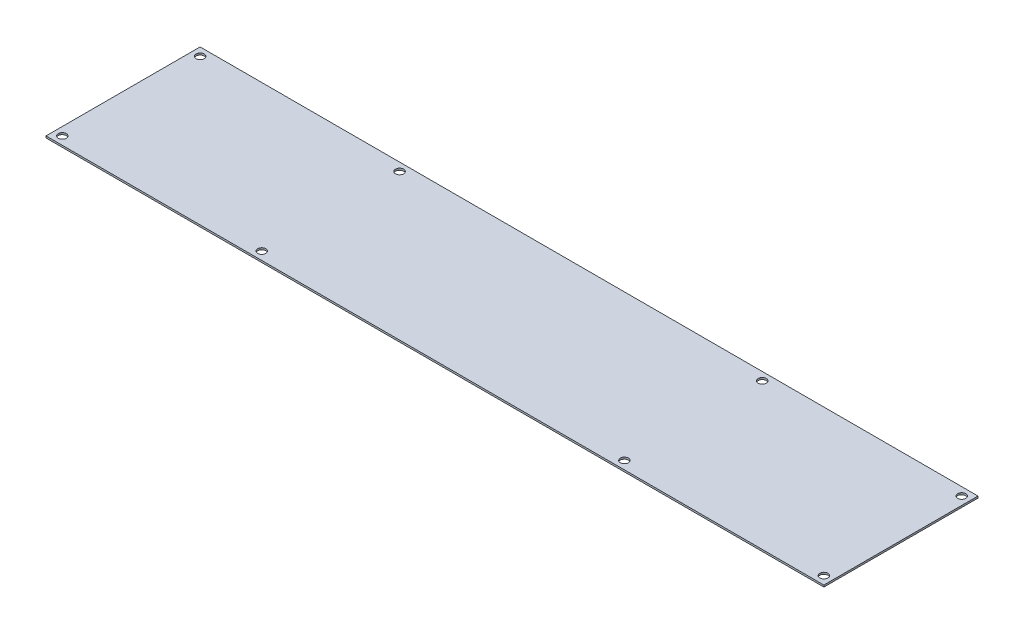
ISO-10303-21;
HEADER;
FILE_DESCRIPTION(('STEP AP214'),'2;1');
FILE_NAME('part.step','',(''),(''),'','','');
FILE_SCHEMA(('AUTOMOTIVE_DESIGN { 1 0 10303 214 1 1 1 1 }'));
ENDSEC;
DATA;
#1=APPLICATION_CONTEXT('core data for automotive mechanical design processes');
#2=APPLICATION_PROTOCOL_DEFINITION('international standard','automotive_design',2000,#1);
#3=PRODUCT_CONTEXT('',#1,'mechanical');
#4=PRODUCT('Part','Part','',(#3));
#5=PRODUCT_RELATED_PRODUCT_CATEGORY('part','',(#4));
#6=PRODUCT_DEFINITION_FORMATION('','',#4);
#7=PRODUCT_DEFINITION_CONTEXT('part definition',#1,'design');
#8=PRODUCT_DEFINITION('design','',#6,#7);
#9=PRODUCT_DEFINITION_SHAPE('','',#8);
#10=(LENGTH_UNIT() NAMED_UNIT(*) SI_UNIT(.MILLI.,.METRE.));
#11=(NAMED_UNIT(*) PLANE_ANGLE_UNIT() SI_UNIT($,.RADIAN.));
#12=(NAMED_UNIT(*) SI_UNIT($,.STERADIAN.) SOLID_ANGLE_UNIT());
#13=UNCERTAINTY_MEASURE_WITH_UNIT(LENGTH_MEASURE(1.E-05),#10,'distance_accuracy_value','');
#14=(GEOMETRIC_REPRESENTATION_CONTEXT(3) GLOBAL_UNCERTAINTY_ASSIGNED_CONTEXT((#13)) GLOBAL_UNIT_ASSIGNED_CONTEXT((#10,
#11,#12)) REPRESENTATION_CONTEXT('',''));
#15=CARTESIAN_POINT('',(0.,0.,0.));
#16=DIRECTION('',(0.,0.,1.));
#17=DIRECTION('',(1.,0.,0.));
#18=AXIS2_PLACEMENT_3D('',#15,#16,#17);
#19=CARTESIAN_POINT('',(0.,1.,0.));
#20=DIRECTION('',(0.,-1.,0.));
#21=DIRECTION('',(0.,0.,-1.));
#22=AXIS2_PLACEMENT_3D('',#19,#20,#21);
#23=PLANE('',#22);
#24=CARTESIAN_POINT('',(-210.,1.,-38.));
#25=DIRECTION('',(0.,1.,0.));
#26=DIRECTION('',(0.,0.,1.));
#27=AXIS2_PLACEMENT_3D('',#24,#25,#26);
#28=CIRCLE('',#27,2.25);
#29=CARTESIAN_POINT('',(-210.,1.,-35.75));
#30=VERTEX_POINT('',#29);
#31=EDGE_CURVE('E191',#30,#30,#28,.T.);
#32=ORIENTED_EDGE('',*,*,#31,.F.);
#33=EDGE_LOOP('',(#32));
#34=FACE_BOUND('',#33,.T.);
#35=CARTESIAN_POINT('',(210.,1.,-38.));
#36=DIRECTION('',(0.,1.,0.));
#37=DIRECTION('',(0.,0.,1.));
#38=AXIS2_PLACEMENT_3D('',#35,#36,#37);
#39=CIRCLE('',#38,2.25);
#40=CARTESIAN_POINT('',(210.,1.,-35.75));
#41=VERTEX_POINT('',#40);
#42=EDGE_CURVE('E183',#41,#41,#39,.T.);
#43=ORIENTED_EDGE('',*,*,#42,.F.);
#44=EDGE_LOOP('',(#43));
#45=FACE_BOUND('',#44,.T.);
#46=CARTESIAN_POINT('',(-100.,1.,-38.));
#47=DIRECTION('',(0.,1.,0.));
#48=DIRECTION('',(0.,0.,1.));
#49=AXIS2_PLACEMENT_3D('',#46,#47,#48);
#50=CIRCLE('',#49,2.25);
#51=CARTESIAN_POINT('',(-100.,1.,-35.75));
#52=VERTEX_POINT('',#51);
#53=EDGE_CURVE('E175',#52,#52,#50,.T.);
#54=ORIENTED_EDGE('',*,*,#53,.F.);
#55=EDGE_LOOP('',(#54));
#56=FACE_BOUND('',#55,.T.);
#57=CARTESIAN_POINT('',(100.,1.,-38.));
#58=DIRECTION('',(0.,1.,0.));
#59=DIRECTION('',(0.,0.,1.));
#60=AXIS2_PLACEMENT_3D('',#57,#58,#59);
#61=CIRCLE('',#60,2.25);
#62=CARTESIAN_POINT('',(100.,1.,-35.75));
#63=VERTEX_POINT('',#62);
#64=EDGE_CURVE('E167',#63,#63,#61,.T.);
#65=ORIENTED_EDGE('',*,*,#64,.F.);
#66=EDGE_LOOP('',(#65));
#67=FACE_BOUND('',#66,.T.);
#68=CARTESIAN_POINT('',(-100.,1.,38.));
#69=DIRECTION('',(0.,1.,0.));
#70=DIRECTION('',(0.,0.,1.));
#71=AXIS2_PLACEMENT_3D('',#68,#69,#70);
#72=CIRCLE('',#71,2.25);
#73=CARTESIAN_POINT('',(-100.,1.,40.25));
#74=VERTEX_POINT('',#73);
#75=EDGE_CURVE('E151',#74,#74,#72,.T.);
#76=ORIENTED_EDGE('',*,*,#75,.F.);
#77=EDGE_LOOP('',(#76));
#78=FACE_BOUND('',#77,.T.);
#79=CARTESIAN_POINT('',(210.,1.,38.));
#80=DIRECTION('',(0.,1.,0.));
#81=DIRECTION('',(0.,0.,1.));
#82=AXIS2_PLACEMENT_3D('',#79,#80,#81);
#83=CIRCLE('',#82,2.25);
#84=CARTESIAN_POINT('',(210.,1.,40.25));
#85=VERTEX_POINT('',#84);
#86=EDGE_CURVE('E143',#85,#85,#83,.T.);
#87=ORIENTED_EDGE('',*,*,#86,.F.);
#88=EDGE_LOOP('',(#87));
#89=FACE_BOUND('',#88,.T.);
#90=CARTESIAN_POINT('',(-210.,1.,38.));
#91=DIRECTION('',(0.,1.,0.));
#92=DIRECTION('',(0.,0.,1.));
#93=AXIS2_PLACEMENT_3D('',#90,#91,#92);
#94=CIRCLE('',#93,2.25);
#95=CARTESIAN_POINT('',(-210.,1.,40.25));
#96=VERTEX_POINT('',#95);
#97=EDGE_CURVE('E135',#96,#96,#94,.T.);
#98=ORIENTED_EDGE('',*,*,#97,.F.);
#99=EDGE_LOOP('',(#98));
#100=FACE_BOUND('',#99,.T.);
#101=DIRECTION('',(0.,0.,-1.));
#102=VECTOR('',#101,1.);
#103=CARTESIAN_POINT('',(214.5,1.,42.5));
#104=LINE('',#103,#102);
#105=CARTESIAN_POINT('',(214.5,1.,42.5));
#106=VERTEX_POINT('',#105);
#107=CARTESIAN_POINT('',(214.5,1.,-42.5));
#108=VERTEX_POINT('',#107);
#109=EDGE_CURVE('E94',#106,#108,#104,.T.);
#110=ORIENTED_EDGE('',*,*,#109,.T.);
#111=DIRECTION('',(-1.,0.,0.));
#112=VECTOR('',#111,1.);
#113=CARTESIAN_POINT('',(-214.5,1.,-42.5));
#114=LINE('',#113,#112);
#115=CARTESIAN_POINT('',(-214.5,1.,-42.5));
#116=VERTEX_POINT('',#115);
#117=EDGE_CURVE('E89',#108,#116,#114,.T.);
#118=ORIENTED_EDGE('',*,*,#117,.T.);
#119=DIRECTION('',(0.,0.,1.));
#120=VECTOR('',#119,1.);
#121=CARTESIAN_POINT('',(-214.5,1.,42.5));
#122=LINE('',#121,#120);
#123=CARTESIAN_POINT('',(-214.5,1.,42.5));
#124=VERTEX_POINT('',#123);
#125=EDGE_CURVE('E92',#116,#124,#122,.T.);
#126=ORIENTED_EDGE('',*,*,#125,.T.);
#127=DIRECTION('',(1.,0.,0.));
#128=VECTOR('',#127,1.);
#129=CARTESIAN_POINT('',(-214.5,1.,42.5));
#130=LINE('',#129,#128);
#131=EDGE_CURVE('E59',#124,#106,#130,.T.);
#132=ORIENTED_EDGE('',*,*,#131,.T.);
#133=EDGE_LOOP('',(#110,#118,#126,#132));
#134=FACE_BOUND('',#133,.T.);
#135=CARTESIAN_POINT('',(100.,1.,38.));
#136=DIRECTION('',(0.,1.,0.));
#137=DIRECTION('',(0.,0.,1.));
#138=AXIS2_PLACEMENT_3D('',#135,#136,#137);
#139=CIRCLE('',#138,2.25);
#140=CARTESIAN_POINT('',(100.,1.,40.25));
#141=VERTEX_POINT('',#140);
#142=EDGE_CURVE('E159',#141,#141,#139,.T.);
#143=ORIENTED_EDGE('',*,*,#142,.F.);
#144=EDGE_LOOP('',(#143));
#145=FACE_BOUND('',#144,.T.);
#146=ADVANCED_FACE('F41',(#34,#45,#56,#67,#78,#89,#100,#134,#145),#23,.F.);
#147=CARTESIAN_POINT('',(0.,0.,0.));
#148=DIRECTION('',(0.,-1.,0.));
#149=DIRECTION('',(0.,0.,-1.));
#150=AXIS2_PLACEMENT_3D('',#147,#148,#149);
#151=PLANE('',#150);
#152=CARTESIAN_POINT('',(-210.,0.,-38.));
#153=DIRECTION('',(0.,1.,0.));
#154=DIRECTION('',(0.,0.,1.));
#155=AXIS2_PLACEMENT_3D('',#152,#153,#154);
#156=CIRCLE('',#155,2.25);
#157=CARTESIAN_POINT('',(-210.,0.,-35.75));
#158=VERTEX_POINT('',#157);
#159=EDGE_CURVE('E187',#158,#158,#156,.T.);
#160=ORIENTED_EDGE('',*,*,#159,.T.);
#161=EDGE_LOOP('',(#160));
#162=FACE_BOUND('',#161,.T.);
#163=CARTESIAN_POINT('',(210.,0.,-38.));
#164=DIRECTION('',(0.,1.,0.));
#165=DIRECTION('',(0.,0.,1.));
#166=AXIS2_PLACEMENT_3D('',#163,#164,#165);
#167=CIRCLE('',#166,2.25);
#168=CARTESIAN_POINT('',(210.,0.,-35.75));
#169=VERTEX_POINT('',#168);
#170=EDGE_CURVE('E179',#169,#169,#167,.T.);
#171=ORIENTED_EDGE('',*,*,#170,.T.);
#172=EDGE_LOOP('',(#171));
#173=FACE_BOUND('',#172,.T.);
#174=CARTESIAN_POINT('',(-100.,0.,-38.));
#175=DIRECTION('',(0.,1.,0.));
#176=DIRECTION('',(0.,0.,1.));
#177=AXIS2_PLACEMENT_3D('',#174,#175,#176);
#178=CIRCLE('',#177,2.25);
#179=CARTESIAN_POINT('',(-100.,0.,-35.75));
#180=VERTEX_POINT('',#179);
#181=EDGE_CURVE('E171',#180,#180,#178,.T.);
#182=ORIENTED_EDGE('',*,*,#181,.T.);
#183=EDGE_LOOP('',(#182));
#184=FACE_BOUND('',#183,.T.);
#185=CARTESIAN_POINT('',(100.,0.,-38.));
#186=DIRECTION('',(0.,1.,0.));
#187=DIRECTION('',(0.,0.,1.));
#188=AXIS2_PLACEMENT_3D('',#185,#186,#187);
#189=CIRCLE('',#188,2.25);
#190=CARTESIAN_POINT('',(100.,0.,-35.75));
#191=VERTEX_POINT('',#190);
#192=EDGE_CURVE('E163',#191,#191,#189,.T.);
#193=ORIENTED_EDGE('',*,*,#192,.T.);
#194=EDGE_LOOP('',(#193));
#195=FACE_BOUND('',#194,.T.);
#196=CARTESIAN_POINT('',(100.,0.,38.));
#197=DIRECTION('',(0.,1.,0.));
#198=DIRECTION('',(0.,0.,1.));
#199=AXIS2_PLACEMENT_3D('',#196,#197,#198);
#200=CIRCLE('',#199,2.25);
#201=CARTESIAN_POINT('',(100.,0.,40.25));
#202=VERTEX_POINT('',#201);
#203=EDGE_CURVE('E155',#202,#202,#200,.T.);
#204=ORIENTED_EDGE('',*,*,#203,.T.);
#205=EDGE_LOOP('',(#204));
#206=FACE_BOUND('',#205,.T.);
#207=DIRECTION('',(0.,0.,-1.));
#208=VECTOR('',#207,1.);
#209=CARTESIAN_POINT('',(214.5,0.,42.5));
#210=LINE('',#209,#208);
#211=CARTESIAN_POINT('',(214.5,0.,42.5));
#212=VERTEX_POINT('',#211);
#213=CARTESIAN_POINT('',(214.5,0.,-42.5));
#214=VERTEX_POINT('',#213);
#215=EDGE_CURVE('E110',#212,#214,#210,.T.);
#216=ORIENTED_EDGE('',*,*,#215,.F.);
#217=DIRECTION('',(1.,0.,0.));
#218=VECTOR('',#217,1.);
#219=CARTESIAN_POINT('',(-214.5,0.,42.5));
#220=LINE('',#219,#218);
#221=CARTESIAN_POINT('',(-214.5,0.,42.5));
#222=VERTEX_POINT('',#221);
#223=EDGE_CURVE('E82',#222,#212,#220,.T.);
#224=ORIENTED_EDGE('',*,*,#223,.F.);
#225=DIRECTION('',(0.,0.,1.));
#226=VECTOR('',#225,1.);
#227=CARTESIAN_POINT('',(-214.5,0.,42.5));
#228=LINE('',#227,#226);
#229=CARTESIAN_POINT('',(-214.5,0.,-42.5));
#230=VERTEX_POINT('',#229);
#231=EDGE_CURVE('E76',#230,#222,#228,.T.);
#232=ORIENTED_EDGE('',*,*,#231,.F.);
#233=DIRECTION('',(-1.,0.,0.));
#234=VECTOR('',#233,1.);
#235=CARTESIAN_POINT('',(-214.5,0.,-42.5));
#236=LINE('',#235,#234);
#237=EDGE_CURVE('E99',#214,#230,#236,.T.);
#238=ORIENTED_EDGE('',*,*,#237,.F.);
#239=EDGE_LOOP('',(#216,#224,#232,#238));
#240=FACE_BOUND('',#239,.T.);
#241=CARTESIAN_POINT('',(-210.,0.,38.));
#242=DIRECTION('',(0.,1.,0.));
#243=DIRECTION('',(0.,0.,1.));
#244=AXIS2_PLACEMENT_3D('',#241,#242,#243);
#245=CIRCLE('',#244,2.25);
#246=CARTESIAN_POINT('',(-210.,0.,40.25));
#247=VERTEX_POINT('',#246);
#248=EDGE_CURVE('E114',#247,#247,#245,.T.);
#249=ORIENTED_EDGE('',*,*,#248,.T.);
#250=EDGE_LOOP('',(#249));
#251=FACE_BOUND('',#250,.T.);
#252=CARTESIAN_POINT('',(210.,0.,38.));
#253=DIRECTION('',(0.,1.,0.));
#254=DIRECTION('',(0.,0.,1.));
#255=AXIS2_PLACEMENT_3D('',#252,#253,#254);
#256=CIRCLE('',#255,2.25);
#257=CARTESIAN_POINT('',(210.,0.,40.25));
#258=VERTEX_POINT('',#257);
#259=EDGE_CURVE('E139',#258,#258,#256,.T.);
#260=ORIENTED_EDGE('',*,*,#259,.T.);
#261=EDGE_LOOP('',(#260));
#262=FACE_BOUND('',#261,.T.);
#263=CARTESIAN_POINT('',(-100.,0.,38.));
#264=DIRECTION('',(0.,1.,0.));
#265=DIRECTION('',(0.,0.,1.));
#266=AXIS2_PLACEMENT_3D('',#263,#264,#265);
#267=CIRCLE('',#266,2.25);
#268=CARTESIAN_POINT('',(-100.,0.,40.25));
#269=VERTEX_POINT('',#268);
#270=EDGE_CURVE('E147',#269,#269,#267,.T.);
#271=ORIENTED_EDGE('',*,*,#270,.T.);
#272=EDGE_LOOP('',(#271));
#273=FACE_BOUND('',#272,.T.);
#274=ADVANCED_FACE('F127',(#162,#173,#184,#195,#206,#240,#251,#262,#273),#151,.T.);
#275=CARTESIAN_POINT('',(214.5,1.,42.5));
#276=DIRECTION('',(-1.,0.,0.));
#277=DIRECTION('',(0.,0.,1.));
#278=AXIS2_PLACEMENT_3D('',#275,#276,#277);
#279=PLANE('',#278);
#280=ORIENTED_EDGE('',*,*,#215,.T.);
#281=DIRECTION('',(0.,-1.,0.));
#282=VECTOR('',#281,1.);
#283=CARTESIAN_POINT('',(214.5,1.,-42.5));
#284=LINE('',#283,#282);
#285=EDGE_CURVE('E11',#108,#214,#284,.T.);
#286=ORIENTED_EDGE('',*,*,#285,.F.);
#287=ORIENTED_EDGE('',*,*,#109,.F.);
#288=DIRECTION('',(0.,-1.,0.));
#289=VECTOR('',#288,1.);
#290=CARTESIAN_POINT('',(214.5,1.,42.5));
#291=LINE('',#290,#289);
#292=EDGE_CURVE('E106',#106,#212,#291,.T.);
#293=ORIENTED_EDGE('',*,*,#292,.T.);
#294=EDGE_LOOP('',(#280,#286,#287,#293));
#295=FACE_BOUND('',#294,.T.);
#296=ADVANCED_FACE('F43',(#295),#279,.F.);
#297=CARTESIAN_POINT('',(-214.5,1.,-42.5));
#298=DIRECTION('',(0.,0.,1.));
#299=DIRECTION('',(1.,0.,0.));
#300=AXIS2_PLACEMENT_3D('',#297,#298,#299);
#301=PLANE('',#300);
#302=ORIENTED_EDGE('',*,*,#237,.T.);
#303=DIRECTION('',(0.,-1.,0.));
#304=VECTOR('',#303,1.);
#305=CARTESIAN_POINT('',(-214.5,1.,-42.5));
#306=LINE('',#305,#304);
#307=EDGE_CURVE('E51',#116,#230,#306,.T.);
#308=ORIENTED_EDGE('',*,*,#307,.F.);
#309=ORIENTED_EDGE('',*,*,#117,.F.);
#310=ORIENTED_EDGE('',*,*,#285,.T.);
#311=EDGE_LOOP('',(#302,#308,#309,#310));
#312=FACE_BOUND('',#311,.T.);
#313=ADVANCED_FACE('F98',(#312),#301,.F.);
#314=CARTESIAN_POINT('',(-214.5,1.,42.5));
#315=DIRECTION('',(1.,0.,0.));
#316=DIRECTION('',(0.,0.,-1.));
#317=AXIS2_PLACEMENT_3D('',#314,#315,#316);
#318=PLANE('',#317);
#319=ORIENTED_EDGE('',*,*,#231,.T.);
#320=DIRECTION('',(0.,-1.,0.));
#321=VECTOR('',#320,1.);
#322=CARTESIAN_POINT('',(-214.5,1.,42.5));
#323=LINE('',#322,#321);
#324=EDGE_CURVE('E101',#124,#222,#323,.T.);
#325=ORIENTED_EDGE('',*,*,#324,.F.);
#326=ORIENTED_EDGE('',*,*,#125,.F.);
#327=ORIENTED_EDGE('',*,*,#307,.T.);
#328=EDGE_LOOP('',(#319,#325,#326,#327));
#329=FACE_BOUND('',#328,.T.);
#330=ADVANCED_FACE('F102',(#329),#318,.F.);
#331=CARTESIAN_POINT('',(-214.5,1.,42.5));
#332=DIRECTION('',(0.,0.,-1.));
#333=DIRECTION('',(-1.,0.,0.));
#334=AXIS2_PLACEMENT_3D('',#331,#332,#333);
#335=PLANE('',#334);
#336=ORIENTED_EDGE('',*,*,#223,.T.);
#337=ORIENTED_EDGE('',*,*,#292,.F.);
#338=ORIENTED_EDGE('',*,*,#131,.F.);
#339=ORIENTED_EDGE('',*,*,#324,.T.);
#340=EDGE_LOOP('',(#336,#337,#338,#339));
#341=FACE_BOUND('',#340,.T.);
#342=ADVANCED_FACE('F124',(#341),#335,.F.);
#343=CARTESIAN_POINT('',(-210.,1.,38.));
#344=DIRECTION('',(0.,1.,0.));
#345=DIRECTION('',(0.,0.,1.));
#346=AXIS2_PLACEMENT_3D('',#343,#344,#345);
#347=CYLINDRICAL_SURFACE('',#346,2.25);
#348=ORIENTED_EDGE('',*,*,#248,.F.);
#349=EDGE_LOOP('',(#348));
#350=FACE_BOUND('',#349,.T.);
#351=ORIENTED_EDGE('',*,*,#97,.T.);
#352=EDGE_LOOP('',(#351));
#353=FACE_BOUND('',#352,.T.);
#354=ADVANCED_FACE('F213',(#350,#353),#347,.F.);
#355=CARTESIAN_POINT('',(210.,1.,38.));
#356=DIRECTION('',(0.,1.,0.));
#357=DIRECTION('',(0.,0.,1.));
#358=AXIS2_PLACEMENT_3D('',#355,#356,#357);
#359=CYLINDRICAL_SURFACE('',#358,2.25);
#360=ORIENTED_EDGE('',*,*,#259,.F.);
#361=EDGE_LOOP('',(#360));
#362=FACE_BOUND('',#361,.T.);
#363=ORIENTED_EDGE('',*,*,#86,.T.);
#364=EDGE_LOOP('',(#363));
#365=FACE_BOUND('',#364,.T.);
#366=ADVANCED_FACE('F215',(#362,#365),#359,.F.);
#367=CARTESIAN_POINT('',(-100.,1.,38.));
#368=DIRECTION('',(0.,1.,0.));
#369=DIRECTION('',(0.,0.,1.));
#370=AXIS2_PLACEMENT_3D('',#367,#368,#369);
#371=CYLINDRICAL_SURFACE('',#370,2.25);
#372=ORIENTED_EDGE('',*,*,#270,.F.);
#373=EDGE_LOOP('',(#372));
#374=FACE_BOUND('',#373,.T.);
#375=ORIENTED_EDGE('',*,*,#75,.T.);
#376=EDGE_LOOP('',(#375));
#377=FACE_BOUND('',#376,.T.);
#378=ADVANCED_FACE('F222',(#374,#377),#371,.F.);
#379=CARTESIAN_POINT('',(100.,1.,38.));
#380=DIRECTION('',(0.,1.,0.));
#381=DIRECTION('',(0.,0.,1.));
#382=AXIS2_PLACEMENT_3D('',#379,#380,#381);
#383=CYLINDRICAL_SURFACE('',#382,2.25);
#384=ORIENTED_EDGE('',*,*,#203,.F.);
#385=EDGE_LOOP('',(#384));
#386=FACE_BOUND('',#385,.T.);
#387=ORIENTED_EDGE('',*,*,#142,.T.);
#388=EDGE_LOOP('',(#387));
#389=FACE_BOUND('',#388,.T.);
#390=ADVANCED_FACE('F288',(#386,#389),#383,.F.);
#391=CARTESIAN_POINT('',(100.,1.,-38.));
#392=DIRECTION('',(0.,1.,0.));
#393=DIRECTION('',(0.,0.,1.));
#394=AXIS2_PLACEMENT_3D('',#391,#392,#393);
#395=CYLINDRICAL_SURFACE('',#394,2.25);
#396=ORIENTED_EDGE('',*,*,#192,.F.);
#397=EDGE_LOOP('',(#396));
#398=FACE_BOUND('',#397,.T.);
#399=ORIENTED_EDGE('',*,*,#64,.T.);
#400=EDGE_LOOP('',(#399));
#401=FACE_BOUND('',#400,.T.);
#402=ADVANCED_FACE('F297',(#398,#401),#395,.F.);
#403=CARTESIAN_POINT('',(-100.,1.,-38.));
#404=DIRECTION('',(0.,1.,0.));
#405=DIRECTION('',(0.,0.,1.));
#406=AXIS2_PLACEMENT_3D('',#403,#404,#405);
#407=CYLINDRICAL_SURFACE('',#406,2.25);
#408=ORIENTED_EDGE('',*,*,#181,.F.);
#409=EDGE_LOOP('',(#408));
#410=FACE_BOUND('',#409,.T.);
#411=ORIENTED_EDGE('',*,*,#53,.T.);
#412=EDGE_LOOP('',(#411));
#413=FACE_BOUND('',#412,.T.);
#414=ADVANCED_FACE('F307',(#410,#413),#407,.F.);
#415=CARTESIAN_POINT('',(210.,1.,-38.));
#416=DIRECTION('',(0.,1.,0.));
#417=DIRECTION('',(0.,0.,1.));
#418=AXIS2_PLACEMENT_3D('',#415,#416,#417);
#419=CYLINDRICAL_SURFACE('',#418,2.25);
#420=ORIENTED_EDGE('',*,*,#170,.F.);
#421=EDGE_LOOP('',(#420));
#422=FACE_BOUND('',#421,.T.);
#423=ORIENTED_EDGE('',*,*,#42,.T.);
#424=EDGE_LOOP('',(#423));
#425=FACE_BOUND('',#424,.T.);
#426=ADVANCED_FACE('F317',(#422,#425),#419,.F.);
#427=CARTESIAN_POINT('',(-210.,1.,-38.));
#428=DIRECTION('',(0.,1.,0.));
#429=DIRECTION('',(0.,0.,1.));
#430=AXIS2_PLACEMENT_3D('',#427,#428,#429);
#431=CYLINDRICAL_SURFACE('',#430,2.25);
#432=ORIENTED_EDGE('',*,*,#159,.F.);
#433=EDGE_LOOP('',(#432));
#434=FACE_BOUND('',#433,.T.);
#435=ORIENTED_EDGE('',*,*,#31,.T.);
#436=EDGE_LOOP('',(#435));
#437=FACE_BOUND('',#436,.T.);
#438=ADVANCED_FACE('F196',(#434,#437),#431,.F.);
#439=CLOSED_SHELL('',(#146,#274,#296,#313,#330,#342,#354,#366,#378,#390,#402,#414,#426,#438));
#440=MANIFOLD_SOLID_BREP('B2',#439);
#441=ADVANCED_BREP_SHAPE_REPRESENTATION('',(#18,#440),#14);
#442=SHAPE_DEFINITION_REPRESENTATION(#9,#441);
ENDSEC;
END-ISO-10303-21;
